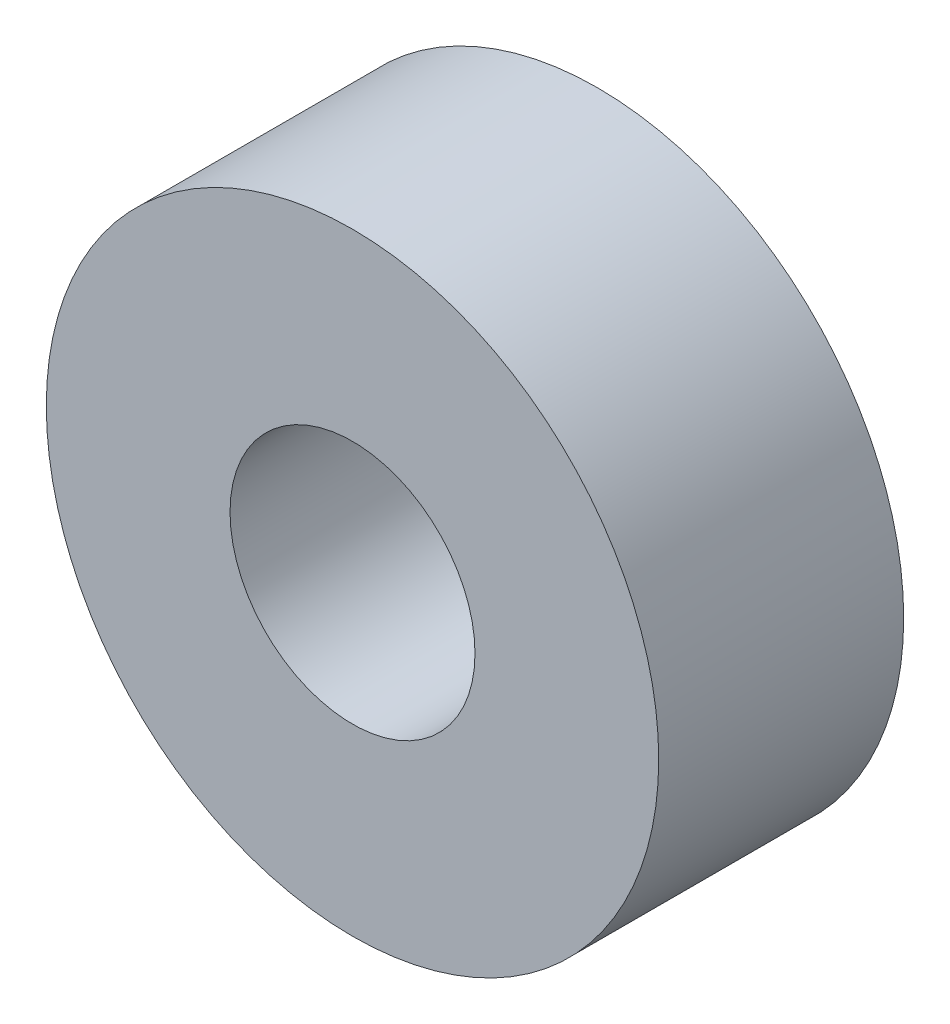
ISO-10303-21;
HEADER;
FILE_DESCRIPTION(('STEP AP214'),'2;1');
FILE_NAME('part.step','',(''),(''),'','','');
FILE_SCHEMA(('AUTOMOTIVE_DESIGN { 1 0 10303 214 1 1 1 1 }'));
ENDSEC;
DATA;
#1=APPLICATION_CONTEXT('core data for automotive mechanical design processes');
#2=APPLICATION_PROTOCOL_DEFINITION('international standard','automotive_design',2000,#1);
#3=PRODUCT_CONTEXT('',#1,'mechanical');
#4=PRODUCT('Part','Part','',(#3));
#5=PRODUCT_RELATED_PRODUCT_CATEGORY('part','',(#4));
#6=PRODUCT_DEFINITION_FORMATION('','',#4);
#7=PRODUCT_DEFINITION_CONTEXT('part definition',#1,'design');
#8=PRODUCT_DEFINITION('design','',#6,#7);
#9=PRODUCT_DEFINITION_SHAPE('','',#8);
#10=(LENGTH_UNIT() NAMED_UNIT(*) SI_UNIT(.MILLI.,.METRE.));
#11=(NAMED_UNIT(*) PLANE_ANGLE_UNIT() SI_UNIT($,.RADIAN.));
#12=(NAMED_UNIT(*) SI_UNIT($,.STERADIAN.) SOLID_ANGLE_UNIT());
#13=UNCERTAINTY_MEASURE_WITH_UNIT(LENGTH_MEASURE(1.E-05),#10,'distance_accuracy_value','');
#14=(GEOMETRIC_REPRESENTATION_CONTEXT(3) GLOBAL_UNCERTAINTY_ASSIGNED_CONTEXT((#13)) GLOBAL_UNIT_ASSIGNED_CONTEXT((#10,
#11,#12)) REPRESENTATION_CONTEXT('',''));
#15=CARTESIAN_POINT('',(0.,0.,0.));
#16=DIRECTION('',(0.,0.,1.));
#17=DIRECTION('',(1.,0.,0.));
#18=AXIS2_PLACEMENT_3D('',#15,#16,#17);
#19=CARTESIAN_POINT('',(0.,0.,2.));
#20=DIRECTION('',(0.,0.,1.));
#21=DIRECTION('',(1.,0.,0.));
#22=AXIS2_PLACEMENT_3D('',#19,#20,#21);
#23=PLANE('',#22);
#24=CARTESIAN_POINT('',(0.,0.,2.));
#25=DIRECTION('',(0.,0.,1.));
#26=DIRECTION('',(1.,0.,0.));
#27=AXIS2_PLACEMENT_3D('',#24,#25,#26);
#28=CIRCLE('',#27,2.5);
#29=CARTESIAN_POINT('',(2.5,0.,2.));
#30=VERTEX_POINT('',#29);
#31=EDGE_CURVE('E11',#30,#30,#28,.T.);
#32=ORIENTED_EDGE('',*,*,#31,.T.);
#33=EDGE_LOOP('',(#32));
#34=FACE_BOUND('',#33,.T.);
#35=CARTESIAN_POINT('',(0.,0.,2.));
#36=DIRECTION('',(0.,0.,1.));
#37=DIRECTION('',(1.,0.,0.));
#38=AXIS2_PLACEMENT_3D('',#35,#36,#37);
#39=CIRCLE('',#38,1.);
#40=CARTESIAN_POINT('',(1.,0.,2.));
#41=VERTEX_POINT('',#40);
#42=EDGE_CURVE('E48',#41,#41,#39,.T.);
#43=ORIENTED_EDGE('',*,*,#42,.F.);
#44=EDGE_LOOP('',(#43));
#45=FACE_BOUND('',#44,.T.);
#46=ADVANCED_FACE('F37',(#34,#45),#23,.T.);
#47=CARTESIAN_POINT('',(0.,0.,0.));
#48=DIRECTION('',(0.,0.,1.));
#49=DIRECTION('',(1.,0.,0.));
#50=AXIS2_PLACEMENT_3D('',#47,#48,#49);
#51=PLANE('',#50);
#52=CARTESIAN_POINT('',(0.,0.,0.));
#53=DIRECTION('',(0.,0.,1.));
#54=DIRECTION('',(1.,0.,0.));
#55=AXIS2_PLACEMENT_3D('',#52,#53,#54);
#56=CIRCLE('',#55,2.5);
#57=CARTESIAN_POINT('',(2.5,0.,0.));
#58=VERTEX_POINT('',#57);
#59=EDGE_CURVE('E41',#58,#58,#56,.T.);
#60=ORIENTED_EDGE('',*,*,#59,.F.);
#61=EDGE_LOOP('',(#60));
#62=FACE_BOUND('',#61,.T.);
#63=CARTESIAN_POINT('',(0.,0.,0.));
#64=DIRECTION('',(0.,0.,1.));
#65=DIRECTION('',(1.,0.,0.));
#66=AXIS2_PLACEMENT_3D('',#63,#64,#65);
#67=CIRCLE('',#66,1.);
#68=CARTESIAN_POINT('',(1.,0.,0.));
#69=VERTEX_POINT('',#68);
#70=EDGE_CURVE('E50',#69,#69,#67,.T.);
#71=ORIENTED_EDGE('',*,*,#70,.T.);
#72=EDGE_LOOP('',(#71));
#73=FACE_BOUND('',#72,.T.);
#74=ADVANCED_FACE('F60',(#62,#73),#51,.F.);
#75=CARTESIAN_POINT('',(0.,0.,2.));
#76=DIRECTION('',(0.,0.,-1.));
#77=DIRECTION('',(-1.,0.,0.));
#78=AXIS2_PLACEMENT_3D('',#75,#76,#77);
#79=CYLINDRICAL_SURFACE('',#78,2.5);
#80=ORIENTED_EDGE('',*,*,#31,.F.);
#81=EDGE_LOOP('',(#80));
#82=FACE_BOUND('',#81,.T.);
#83=ORIENTED_EDGE('',*,*,#59,.T.);
#84=EDGE_LOOP('',(#83));
#85=FACE_BOUND('',#84,.T.);
#86=ADVANCED_FACE('F39',(#82,#85),#79,.T.);
#87=CARTESIAN_POINT('',(0.,0.,2.));
#88=DIRECTION('',(0.,0.,-1.));
#89=DIRECTION('',(-1.,0.,0.));
#90=AXIS2_PLACEMENT_3D('',#87,#88,#89);
#91=CYLINDRICAL_SURFACE('',#90,1.);
#92=ORIENTED_EDGE('',*,*,#42,.T.);
#93=EDGE_LOOP('',(#92));
#94=FACE_BOUND('',#93,.T.);
#95=ORIENTED_EDGE('',*,*,#70,.F.);
#96=EDGE_LOOP('',(#95));
#97=FACE_BOUND('',#96,.T.);
#98=ADVANCED_FACE('F56',(#94,#97),#91,.F.);
#99=CLOSED_SHELL('',(#46,#74,#86,#98));
#100=MANIFOLD_SOLID_BREP('B2',#99);
#101=ADVANCED_BREP_SHAPE_REPRESENTATION('',(#18,#100),#14);
#102=SHAPE_DEFINITION_REPRESENTATION(#9,#101);
ENDSEC;
END-ISO-10303-21;
